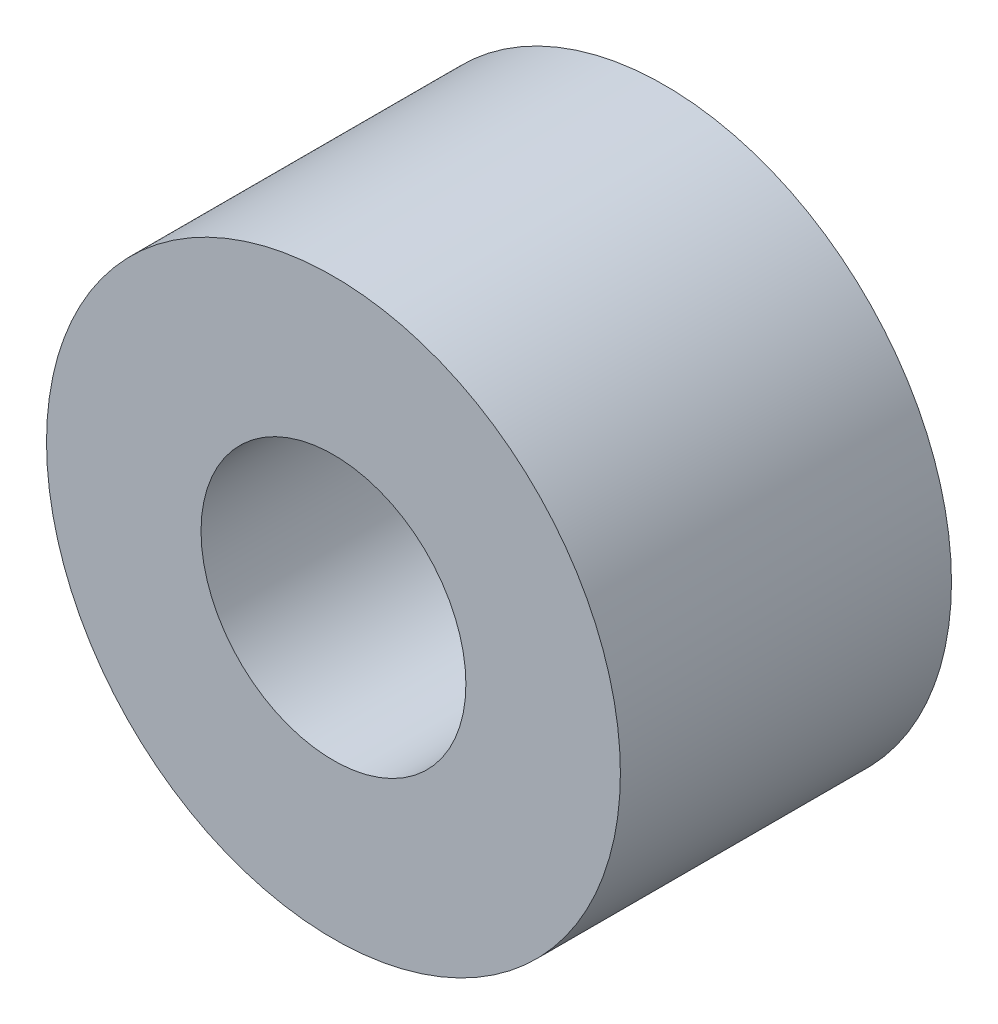
ISO-10303-21;
HEADER;
FILE_DESCRIPTION(('STEP AP214'),'2;1');
FILE_NAME('part.step','',(''),(''),'','','');
FILE_SCHEMA(('AUTOMOTIVE_DESIGN { 1 0 10303 214 1 1 1 1 }'));
ENDSEC;
DATA;
#1=APPLICATION_CONTEXT('core data for automotive mechanical design processes');
#2=APPLICATION_PROTOCOL_DEFINITION('international standard','automotive_design',2000,#1);
#3=PRODUCT_CONTEXT('',#1,'mechanical');
#4=PRODUCT('Part','Part','',(#3));
#5=PRODUCT_RELATED_PRODUCT_CATEGORY('part','',(#4));
#6=PRODUCT_DEFINITION_FORMATION('','',#4);
#7=PRODUCT_DEFINITION_CONTEXT('part definition',#1,'design');
#8=PRODUCT_DEFINITION('design','',#6,#7);
#9=PRODUCT_DEFINITION_SHAPE('','',#8);
#10=(LENGTH_UNIT() NAMED_UNIT(*) SI_UNIT(.MILLI.,.METRE.));
#11=(NAMED_UNIT(*) PLANE_ANGLE_UNIT() SI_UNIT($,.RADIAN.));
#12=(NAMED_UNIT(*) SI_UNIT($,.STERADIAN.) SOLID_ANGLE_UNIT());
#13=UNCERTAINTY_MEASURE_WITH_UNIT(LENGTH_MEASURE(1.E-05),#10,'distance_accuracy_value','');
#14=(GEOMETRIC_REPRESENTATION_CONTEXT(3) GLOBAL_UNCERTAINTY_ASSIGNED_CONTEXT((#13)) GLOBAL_UNIT_ASSIGNED_CONTEXT((#10,
#11,#12)) REPRESENTATION_CONTEXT('',''));
#15=CARTESIAN_POINT('',(0.,0.,0.));
#16=DIRECTION('',(0.,0.,1.));
#17=DIRECTION('',(1.,0.,0.));
#18=AXIS2_PLACEMENT_3D('',#15,#16,#17);
#19=CARTESIAN_POINT('',(0.,0.,7.5));
#20=DIRECTION('',(0.,0.,1.));
#21=DIRECTION('',(1.,0.,0.));
#22=AXIS2_PLACEMENT_3D('',#19,#20,#21);
#23=PLANE('',#22);
#24=CARTESIAN_POINT('',(0.,0.,7.5));
#25=DIRECTION('',(0.,0.,1.));
#26=DIRECTION('',(1.,0.,0.));
#27=AXIS2_PLACEMENT_3D('',#24,#25,#26);
#28=CIRCLE('',#27,6.5);
#29=CARTESIAN_POINT('',(6.5,0.,7.5));
#30=VERTEX_POINT('',#29);
#31=EDGE_CURVE('E10',#30,#30,#28,.T.);
#32=ORIENTED_EDGE('',*,*,#31,.T.);
#33=EDGE_LOOP('',(#32));
#34=FACE_BOUND('',#33,.T.);
#35=CARTESIAN_POINT('',(0.,0.,7.5));
#36=DIRECTION('',(0.,0.,1.));
#37=DIRECTION('',(1.,0.,0.));
#38=AXIS2_PLACEMENT_3D('',#35,#36,#37);
#39=CIRCLE('',#38,3.);
#40=CARTESIAN_POINT('',(3.,0.,7.5));
#41=VERTEX_POINT('',#40);
#42=EDGE_CURVE('E51',#41,#41,#39,.T.);
#43=ORIENTED_EDGE('',*,*,#42,.F.);
#44=EDGE_LOOP('',(#43));
#45=FACE_BOUND('',#44,.T.);
#46=ADVANCED_FACE('F40',(#34,#45),#23,.T.);
#47=CARTESIAN_POINT('',(0.,0.,0.));
#48=DIRECTION('',(0.,0.,1.));
#49=DIRECTION('',(1.,0.,0.));
#50=AXIS2_PLACEMENT_3D('',#47,#48,#49);
#51=PLANE('',#50);
#52=CARTESIAN_POINT('',(0.,0.,0.));
#53=DIRECTION('',(0.,0.,1.));
#54=DIRECTION('',(1.,0.,0.));
#55=AXIS2_PLACEMENT_3D('',#52,#53,#54);
#56=CIRCLE('',#55,6.5);
#57=CARTESIAN_POINT('',(6.5,0.,0.));
#58=VERTEX_POINT('',#57);
#59=EDGE_CURVE('E44',#58,#58,#56,.T.);
#60=ORIENTED_EDGE('',*,*,#59,.F.);
#61=EDGE_LOOP('',(#60));
#62=FACE_BOUND('',#61,.T.);
#63=CARTESIAN_POINT('',(0.,0.,0.));
#64=DIRECTION('',(0.,0.,1.));
#65=DIRECTION('',(1.,0.,0.));
#66=AXIS2_PLACEMENT_3D('',#63,#64,#65);
#67=CIRCLE('',#66,3.);
#68=CARTESIAN_POINT('',(3.,0.,0.));
#69=VERTEX_POINT('',#68);
#70=EDGE_CURVE('E53',#69,#69,#67,.T.);
#71=ORIENTED_EDGE('',*,*,#70,.T.);
#72=EDGE_LOOP('',(#71));
#73=FACE_BOUND('',#72,.T.);
#74=ADVANCED_FACE('F63',(#62,#73),#51,.F.);
#75=CARTESIAN_POINT('',(0.,0.,7.5));
#76=DIRECTION('',(0.,0.,-1.));
#77=DIRECTION('',(-1.,0.,0.));
#78=AXIS2_PLACEMENT_3D('',#75,#76,#77);
#79=CYLINDRICAL_SURFACE('',#78,6.5);
#80=ORIENTED_EDGE('',*,*,#31,.F.);
#81=EDGE_LOOP('',(#80));
#82=FACE_BOUND('',#81,.T.);
#83=ORIENTED_EDGE('',*,*,#59,.T.);
#84=EDGE_LOOP('',(#83));
#85=FACE_BOUND('',#84,.T.);
#86=ADVANCED_FACE('F42',(#82,#85),#79,.T.);
#87=CARTESIAN_POINT('',(0.,0.,7.5));
#88=DIRECTION('',(0.,0.,-1.));
#89=DIRECTION('',(-1.,0.,0.));
#90=AXIS2_PLACEMENT_3D('',#87,#88,#89);
#91=CYLINDRICAL_SURFACE('',#90,3.);
#92=ORIENTED_EDGE('',*,*,#42,.T.);
#93=EDGE_LOOP('',(#92));
#94=FACE_BOUND('',#93,.T.);
#95=ORIENTED_EDGE('',*,*,#70,.F.);
#96=EDGE_LOOP('',(#95));
#97=FACE_BOUND('',#96,.T.);
#98=ADVANCED_FACE('F59',(#94,#97),#91,.F.);
#99=CLOSED_SHELL('',(#46,#74,#86,#98));
#100=MANIFOLD_SOLID_BREP('B2',#99);
#101=ADVANCED_BREP_SHAPE_REPRESENTATION('',(#18,#100),#14);
#102=SHAPE_DEFINITION_REPRESENTATION(#9,#101);
ENDSEC;
END-ISO-10303-21;
